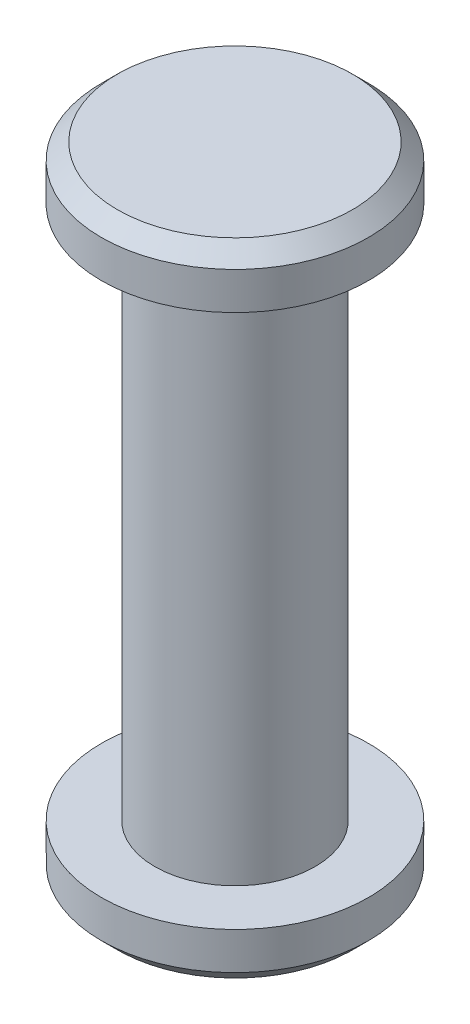
ISO-10303-21;
HEADER;
FILE_DESCRIPTION(('STEP AP214'),'2;1');
FILE_NAME('part.step','',(''),(''),'','','');
FILE_SCHEMA(('AUTOMOTIVE_DESIGN { 1 0 10303 214 1 1 1 1 }'));
ENDSEC;
DATA;
#1=APPLICATION_CONTEXT('core data for automotive mechanical design processes');
#2=APPLICATION_PROTOCOL_DEFINITION('international standard','automotive_design',2000,#1);
#3=PRODUCT_CONTEXT('',#1,'mechanical');
#4=PRODUCT('Part','Part','',(#3));
#5=PRODUCT_RELATED_PRODUCT_CATEGORY('part','',(#4));
#6=PRODUCT_DEFINITION_FORMATION('','',#4);
#7=PRODUCT_DEFINITION_CONTEXT('part definition',#1,'design');
#8=PRODUCT_DEFINITION('design','',#6,#7);
#9=PRODUCT_DEFINITION_SHAPE('','',#8);
#10=(LENGTH_UNIT() NAMED_UNIT(*) SI_UNIT(.MILLI.,.METRE.));
#11=(NAMED_UNIT(*) PLANE_ANGLE_UNIT() SI_UNIT($,.RADIAN.));
#12=(NAMED_UNIT(*) SI_UNIT($,.STERADIAN.) SOLID_ANGLE_UNIT());
#13=UNCERTAINTY_MEASURE_WITH_UNIT(LENGTH_MEASURE(1.E-05),#10,'distance_accuracy_value','');
#14=(GEOMETRIC_REPRESENTATION_CONTEXT(3) GLOBAL_UNCERTAINTY_ASSIGNED_CONTEXT((#13)) GLOBAL_UNIT_ASSIGNED_CONTEXT((#10,
#11,#12)) REPRESENTATION_CONTEXT('',''));
#15=CARTESIAN_POINT('',(0.,0.,0.));
#16=DIRECTION('',(0.,0.,1.));
#17=DIRECTION('',(1.,0.,0.));
#18=AXIS2_PLACEMENT_3D('',#15,#16,#17);
#19=CARTESIAN_POINT('',(0.,60.,0.));
#20=DIRECTION('',(0.,1.,0.));
#21=DIRECTION('',(0.,0.,1.));
#22=AXIS2_PLACEMENT_3D('',#19,#20,#21);
#23=PLANE('',#22);
#24=CARTESIAN_POINT('',(0.,60.,0.));
#25=DIRECTION('',(0.,1.,0.));
#26=DIRECTION('',(0.,0.,1.));
#27=AXIS2_PLACEMENT_3D('',#24,#25,#26);
#28=CIRCLE('',#27,22.);
#29=CARTESIAN_POINT('',(0.,60.,22.));
#30=VERTEX_POINT('',#29);
#31=EDGE_CURVE('E53',#30,#30,#28,.T.);
#32=ORIENTED_EDGE('',*,*,#31,.T.);
#33=EDGE_LOOP('',(#32));
#34=FACE_BOUND('',#33,.T.);
#35=ADVANCED_FACE('F37',(#34),#23,.T.);
#36=CARTESIAN_POINT('',(0.,100.283380956635,0.));
#37=DIRECTION('',(0.,1.,0.));
#38=DIRECTION('',(0.,0.,1.));
#39=AXIS2_PLACEMENT_3D('',#36,#37,#38);
#40=CYLINDRICAL_SURFACE('',#39,25.);
#41=CARTESIAN_POINT('',(0.,57.,0.));
#42=DIRECTION('',(0.,1.,0.));
#43=DIRECTION('',(0.,0.,1.));
#44=AXIS2_PLACEMENT_3D('',#41,#42,#43);
#45=CIRCLE('',#44,25.);
#46=CARTESIAN_POINT('',(0.,57.,25.));
#47=VERTEX_POINT('',#46);
#48=EDGE_CURVE('E49',#47,#47,#45,.F.);
#49=ORIENTED_EDGE('',*,*,#48,.T.);
#50=EDGE_LOOP('',(#49));
#51=FACE_BOUND('',#50,.T.);
#52=CARTESIAN_POINT('',(0.,50.,0.));
#53=DIRECTION('',(0.,1.,0.));
#54=DIRECTION('',(0.,0.,1.));
#55=AXIS2_PLACEMENT_3D('',#52,#53,#54);
#56=CIRCLE('',#55,25.);
#57=CARTESIAN_POINT('',(0.,50.,25.));
#58=VERTEX_POINT('',#57);
#59=EDGE_CURVE('E58',#58,#58,#56,.T.);
#60=ORIENTED_EDGE('',*,*,#59,.T.);
#61=EDGE_LOOP('',(#60));
#62=FACE_BOUND('',#61,.T.);
#63=ADVANCED_FACE('F87',(#51,#62),#40,.T.);
#64=CARTESIAN_POINT('',(-25.,50.,0.));
#65=DIRECTION('',(0.,-1.,0.));
#66=DIRECTION('',(0.,0.,-1.));
#67=AXIS2_PLACEMENT_3D('',#64,#65,#66);
#68=PLANE('',#67);
#69=CARTESIAN_POINT('',(0.,50.,0.));
#70=DIRECTION('',(0.,1.,0.));
#71=DIRECTION('',(0.,0.,1.));
#72=AXIS2_PLACEMENT_3D('',#69,#70,#71);
#73=CIRCLE('',#72,15.);
#74=CARTESIAN_POINT('',(0.,50.,15.));
#75=VERTEX_POINT('',#74);
#76=EDGE_CURVE('E61',#75,#75,#73,.T.);
#77=ORIENTED_EDGE('',*,*,#76,.T.);
#78=EDGE_LOOP('',(#77));
#79=FACE_BOUND('',#78,.T.);
#80=ORIENTED_EDGE('',*,*,#59,.F.);
#81=EDGE_LOOP('',(#80));
#82=FACE_BOUND('',#81,.T.);
#83=ADVANCED_FACE('F93',(#79,#82),#68,.T.);
#84=CARTESIAN_POINT('',(0.,100.283380956635,0.));
#85=DIRECTION('',(0.,1.,0.));
#86=DIRECTION('',(0.,0.,1.));
#87=AXIS2_PLACEMENT_3D('',#84,#85,#86);
#88=CYLINDRICAL_SURFACE('',#87,15.);
#89=CARTESIAN_POINT('',(0.,-50.,0.));
#90=DIRECTION('',(0.,1.,0.));
#91=DIRECTION('',(0.,0.,1.));
#92=AXIS2_PLACEMENT_3D('',#89,#90,#91);
#93=CIRCLE('',#92,15.);
#94=CARTESIAN_POINT('',(0.,-50.,15.));
#95=VERTEX_POINT('',#94);
#96=EDGE_CURVE('E64',#95,#95,#93,.T.);
#97=ORIENTED_EDGE('',*,*,#96,.T.);
#98=EDGE_LOOP('',(#97));
#99=FACE_BOUND('',#98,.T.);
#100=ORIENTED_EDGE('',*,*,#76,.F.);
#101=EDGE_LOOP('',(#100));
#102=FACE_BOUND('',#101,.T.);
#103=ADVANCED_FACE('F84',(#99,#102),#88,.T.);
#104=CARTESIAN_POINT('',(-25.,-50.,0.));
#105=DIRECTION('',(0.,1.,0.));
#106=DIRECTION('',(0.,0.,1.));
#107=AXIS2_PLACEMENT_3D('',#104,#105,#106);
#108=PLANE('',#107);
#109=CARTESIAN_POINT('',(0.,-50.,0.));
#110=DIRECTION('',(0.,1.,0.));
#111=DIRECTION('',(0.,0.,1.));
#112=AXIS2_PLACEMENT_3D('',#109,#110,#111);
#113=CIRCLE('',#112,25.);
#114=CARTESIAN_POINT('',(0.,-50.,25.));
#115=VERTEX_POINT('',#114);
#116=EDGE_CURVE('E67',#115,#115,#113,.T.);
#117=ORIENTED_EDGE('',*,*,#116,.T.);
#118=EDGE_LOOP('',(#117));
#119=FACE_BOUND('',#118,.T.);
#120=ORIENTED_EDGE('',*,*,#96,.F.);
#121=EDGE_LOOP('',(#120));
#122=FACE_BOUND('',#121,.T.);
#123=ADVANCED_FACE('F71',(#119,#122),#108,.T.);
#124=CARTESIAN_POINT('',(0.,100.283380956635,0.));
#125=DIRECTION('',(0.,1.,0.));
#126=DIRECTION('',(0.,0.,1.));
#127=AXIS2_PLACEMENT_3D('',#124,#125,#126);
#128=CYLINDRICAL_SURFACE('',#127,25.);
#129=CARTESIAN_POINT('',(0.,-57.,0.));
#130=DIRECTION('',(0.,-1.,0.));
#131=DIRECTION('',(0.,0.,-1.));
#132=AXIS2_PLACEMENT_3D('',#129,#130,#131);
#133=CIRCLE('',#132,25.);
#134=CARTESIAN_POINT('',(0.,-57.,-25.));
#135=VERTEX_POINT('',#134);
#136=EDGE_CURVE('E45',#135,#135,#133,.F.);
#137=ORIENTED_EDGE('',*,*,#136,.T.);
#138=EDGE_LOOP('',(#137));
#139=FACE_BOUND('',#138,.T.);
#140=ORIENTED_EDGE('',*,*,#116,.F.);
#141=EDGE_LOOP('',(#140));
#142=FACE_BOUND('',#141,.T.);
#143=ADVANCED_FACE('F74',(#139,#142),#128,.T.);
#144=CARTESIAN_POINT('',(0.,-60.,0.));
#145=DIRECTION('',(0.,-1.,0.));
#146=DIRECTION('',(0.,0.,-1.));
#147=AXIS2_PLACEMENT_3D('',#144,#145,#146);
#148=PLANE('',#147);
#149=CARTESIAN_POINT('',(0.,-60.,0.));
#150=DIRECTION('',(0.,-1.,0.));
#151=DIRECTION('',(0.,0.,-1.));
#152=AXIS2_PLACEMENT_3D('',#149,#150,#151);
#153=CIRCLE('',#152,22.);
#154=CARTESIAN_POINT('',(0.,-60.,-22.));
#155=VERTEX_POINT('',#154);
#156=EDGE_CURVE('E10',#155,#155,#153,.T.);
#157=ORIENTED_EDGE('',*,*,#156,.T.);
#158=EDGE_LOOP('',(#157));
#159=FACE_BOUND('',#158,.T.);
#160=ADVANCED_FACE('F76',(#159),#148,.T.);
#161=CARTESIAN_POINT('',(0.,60.,0.));
#162=DIRECTION('',(0.,-1.,0.));
#163=DIRECTION('',(0.,0.,-1.));
#164=AXIS2_PLACEMENT_3D('',#161,#162,#163);
#165=CONICAL_SURFACE('',#164,22.,0.785398163397446);
#166=ORIENTED_EDGE('',*,*,#48,.F.);
#167=EDGE_LOOP('',(#166));
#168=FACE_BOUND('',#167,.T.);
#169=ORIENTED_EDGE('',*,*,#31,.F.);
#170=EDGE_LOOP('',(#169));
#171=FACE_BOUND('',#170,.T.);
#172=ADVANCED_FACE('F82',(#168,#171),#165,.T.);
#173=CARTESIAN_POINT('',(0.,-57.,0.));
#174=DIRECTION('',(0.,1.,0.));
#175=DIRECTION('',(0.,0.,1.));
#176=AXIS2_PLACEMENT_3D('',#173,#174,#175);
#177=CONICAL_SURFACE('',#176,25.,0.785398163397455);
#178=ORIENTED_EDGE('',*,*,#156,.F.);
#179=EDGE_LOOP('',(#178));
#180=FACE_BOUND('',#179,.T.);
#181=ORIENTED_EDGE('',*,*,#136,.F.);
#182=EDGE_LOOP('',(#181));
#183=FACE_BOUND('',#182,.T.);
#184=ADVANCED_FACE('F40',(#180,#183),#177,.T.);
#185=CLOSED_SHELL('',(#35,#63,#83,#103,#123,#143,#160,#172,#184));
#186=MANIFOLD_SOLID_BREP('B2',#185);
#187=ADVANCED_BREP_SHAPE_REPRESENTATION('',(#18,#186),#14);
#188=SHAPE_DEFINITION_REPRESENTATION(#9,#187);
ENDSEC;
END-ISO-10303-21;
